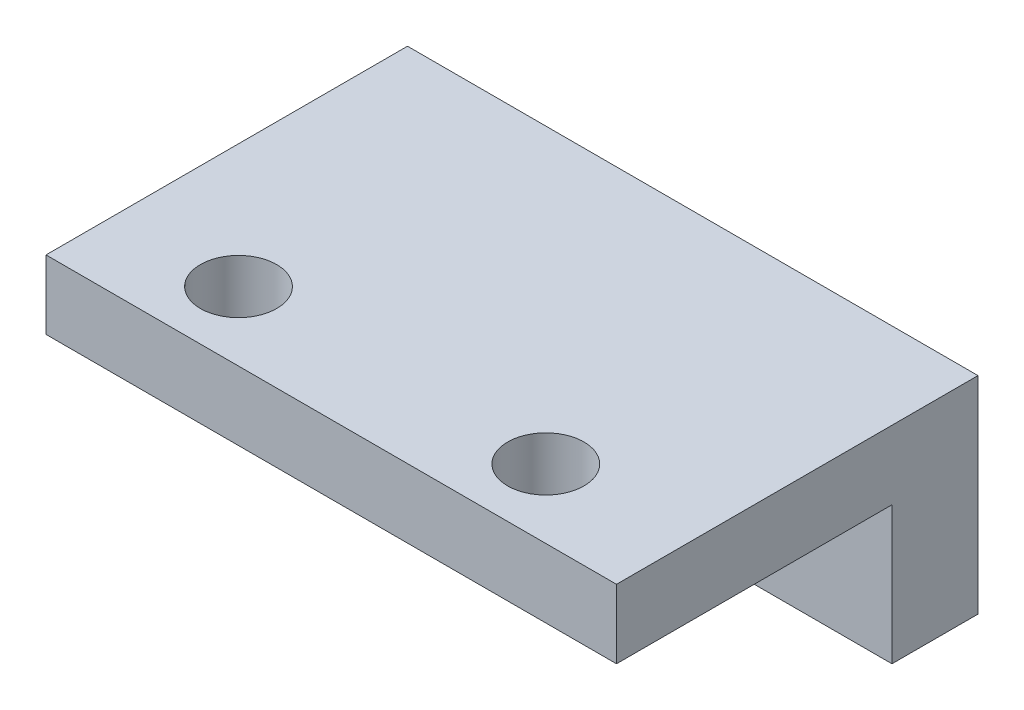
ISO-10303-21;
HEADER;
FILE_DESCRIPTION(('STEP AP214'),'2;1');
FILE_NAME('part.step','',(''),(''),'','','');
FILE_SCHEMA(('AUTOMOTIVE_DESIGN { 1 0 10303 214 1 1 1 1 }'));
ENDSEC;
DATA;
#1=APPLICATION_CONTEXT('core data for automotive mechanical design processes');
#2=APPLICATION_PROTOCOL_DEFINITION('international standard','automotive_design',2000,#1);
#3=PRODUCT_CONTEXT('',#1,'mechanical');
#4=PRODUCT('Part','Part','',(#3));
#5=PRODUCT_RELATED_PRODUCT_CATEGORY('part','',(#4));
#6=PRODUCT_DEFINITION_FORMATION('','',#4);
#7=PRODUCT_DEFINITION_CONTEXT('part definition',#1,'design');
#8=PRODUCT_DEFINITION('design','',#6,#7);
#9=PRODUCT_DEFINITION_SHAPE('','',#8);
#10=(LENGTH_UNIT() NAMED_UNIT(*) SI_UNIT(.MILLI.,.METRE.));
#11=(NAMED_UNIT(*) PLANE_ANGLE_UNIT() SI_UNIT($,.RADIAN.));
#12=(NAMED_UNIT(*) SI_UNIT($,.STERADIAN.) SOLID_ANGLE_UNIT());
#13=UNCERTAINTY_MEASURE_WITH_UNIT(LENGTH_MEASURE(1.E-05),#10,'distance_accuracy_value','');
#14=(GEOMETRIC_REPRESENTATION_CONTEXT(3) GLOBAL_UNCERTAINTY_ASSIGNED_CONTEXT((#13)) GLOBAL_UNIT_ASSIGNED_CONTEXT((#10,
#11,#12)) REPRESENTATION_CONTEXT('',''));
#15=CARTESIAN_POINT('',(0.,0.,0.));
#16=DIRECTION('',(0.,0.,1.));
#17=DIRECTION('',(1.,0.,0.));
#18=AXIS2_PLACEMENT_3D('',#15,#16,#17);
#19=CARTESIAN_POINT('',(0.,0.,20.));
#20=DIRECTION('',(0.,0.,-1.));
#21=DIRECTION('',(-1.,0.,0.));
#22=AXIS2_PLACEMENT_3D('',#19,#20,#21);
#23=PLANE('',#22);
#24=DIRECTION('',(0.,-1.,0.));
#25=VECTOR('',#24,1.);
#26=CARTESIAN_POINT('',(-47.7101744632059,-28.3065134969351,20.));
#27=LINE('',#26,#25);
#28=CARTESIAN_POINT('',(-47.7101744632059,-24.4965134969351,20.));
#29=VERTEX_POINT('',#28);
#30=CARTESIAN_POINT('',(-47.7101744632059,-28.3065134969351,20.));
#31=VERTEX_POINT('',#30);
#32=EDGE_CURVE('E90',#29,#31,#27,.T.);
#33=ORIENTED_EDGE('',*,*,#32,.T.);
#34=DIRECTION('',(-1.,0.,0.));
#35=VECTOR('',#34,1.);
#36=CARTESIAN_POINT('',(-47.7101744632059,-28.3065134969351,20.));
#37=LINE('',#36,#35);
#38=CARTESIAN_POINT('',(-16.1475056161858,-28.3065134969351,20.));
#39=VERTEX_POINT('',#38);
#40=EDGE_CURVE('E122',#39,#31,#37,.T.);
#41=ORIENTED_EDGE('',*,*,#40,.F.);
#42=DIRECTION('',(0.,1.,0.));
#43=VECTOR('',#42,1.);
#44=CARTESIAN_POINT('',(-16.1475056161858,-28.3065134969351,20.));
#45=LINE('',#44,#43);
#46=CARTESIAN_POINT('',(-16.1475056161858,-24.4965134969351,20.));
#47=VERTEX_POINT('',#46);
#48=EDGE_CURVE('E104',#39,#47,#45,.T.);
#49=ORIENTED_EDGE('',*,*,#48,.T.);
#50=DIRECTION('',(-1.,0.,0.));
#51=VECTOR('',#50,1.);
#52=CARTESIAN_POINT('',(-47.7101744632059,-24.4965134969351,20.));
#53=LINE('',#52,#51);
#54=EDGE_CURVE('E60',#47,#29,#53,.T.);
#55=ORIENTED_EDGE('',*,*,#54,.T.);
#56=EDGE_LOOP('',(#33,#41,#49,#55));
#57=FACE_BOUND('',#56,.T.);
#58=ADVANCED_FACE('F34',(#57),#23,.F.);
#59=CARTESIAN_POINT('',(0.,0.,0.));
#60=DIRECTION('',(0.,0.,-1.));
#61=DIRECTION('',(-1.,0.,0.));
#62=AXIS2_PLACEMENT_3D('',#59,#60,#61);
#63=PLANE('',#62);
#64=CARTESIAN_POINT('',(-40.8685682246879,-32.1165134969351,0.));
#65=DIRECTION('',(0.,0.,1.));
#66=DIRECTION('',(1.,0.,0.));
#67=AXIS2_PLACEMENT_3D('',#64,#65,#66);
#68=CIRCLE('',#67,2.);
#69=CARTESIAN_POINT('',(-38.8685682246879,-32.1165134969351,0.));
#70=VERTEX_POINT('',#69);
#71=EDGE_CURVE('E150',#70,#70,#68,.T.);
#72=ORIENTED_EDGE('',*,*,#71,.T.);
#73=EDGE_LOOP('',(#72));
#74=FACE_BOUND('',#73,.T.);
#75=DIRECTION('',(-1.,0.,0.));
#76=VECTOR('',#75,1.);
#77=CARTESIAN_POINT('',(-47.7101744632059,-24.4965134969351,0.));
#78=LINE('',#77,#76);
#79=CARTESIAN_POINT('',(-16.1475056161858,-24.4965134969351,0.));
#80=VERTEX_POINT('',#79);
#81=CARTESIAN_POINT('',(-47.7101744632059,-24.4965134969351,0.));
#82=VERTEX_POINT('',#81);
#83=EDGE_CURVE('E103',#80,#82,#78,.T.);
#84=ORIENTED_EDGE('',*,*,#83,.F.);
#85=DIRECTION('',(0.,1.,0.));
#86=VECTOR('',#85,1.);
#87=CARTESIAN_POINT('',(-16.1475056161858,-28.3065134969351,0.));
#88=LINE('',#87,#86);
#89=CARTESIAN_POINT('',(-16.1475056161858,-35.9265134969351,0.));
#90=VERTEX_POINT('',#89);
#91=EDGE_CURVE('E84',#90,#80,#88,.T.);
#92=ORIENTED_EDGE('',*,*,#91,.F.);
#93=DIRECTION('',(1.,0.,0.));
#94=VECTOR('',#93,1.);
#95=CARTESIAN_POINT('',(-16.1475056161858,-35.9265134969351,0.));
#96=LINE('',#95,#94);
#97=CARTESIAN_POINT('',(-47.7101744632059,-35.9265134969351,0.));
#98=VERTEX_POINT('',#97);
#99=EDGE_CURVE('E93',#98,#90,#96,.T.);
#100=ORIENTED_EDGE('',*,*,#99,.F.);
#101=DIRECTION('',(0.,-1.,0.));
#102=VECTOR('',#101,1.);
#103=CARTESIAN_POINT('',(-47.7101744632059,-28.3065134969351,0.));
#104=LINE('',#103,#102);
#105=EDGE_CURVE('E98',#82,#98,#104,.T.);
#106=ORIENTED_EDGE('',*,*,#105,.F.);
#107=EDGE_LOOP('',(#84,#92,#100,#106));
#108=FACE_BOUND('',#107,.T.);
#109=CARTESIAN_POINT('',(-23.8685682246964,-32.1165304531927,0.));
#110=DIRECTION('',(0.,0.,1.));
#111=DIRECTION('',(1.,0.,0.));
#112=AXIS2_PLACEMENT_3D('',#109,#110,#111);
#113=CIRCLE('',#112,2.00000000000001);
#114=CARTESIAN_POINT('',(-21.8685682246964,-32.1165304531927,0.));
#115=VERTEX_POINT('',#114);
#116=EDGE_CURVE('E147',#115,#115,#113,.T.);
#117=ORIENTED_EDGE('',*,*,#116,.T.);
#118=EDGE_LOOP('',(#117));
#119=FACE_BOUND('',#118,.T.);
#120=ADVANCED_FACE('F100',(#74,#108,#119),#63,.T.);
#121=CARTESIAN_POINT('',(-47.7101744632059,-24.4965134969351,20.));
#122=DIRECTION('',(0.,-1.,0.));
#123=DIRECTION('',(0.,0.,-1.));
#124=AXIS2_PLACEMENT_3D('',#121,#122,#123);
#125=PLANE('',#124);
#126=CARTESIAN_POINT('',(-23.8685682246964,-24.4965134969351,16.19));
#127=DIRECTION('',(0.,1.,0.));
#128=DIRECTION('',(0.,0.,1.));
#129=AXIS2_PLACEMENT_3D('',#126,#127,#128);
#130=CIRCLE('',#129,2.11);
#131=CARTESIAN_POINT('',(-23.8685682246964,-24.4965134969351,18.3));
#132=VERTEX_POINT('',#131);
#133=EDGE_CURVE('E118',#132,#132,#130,.T.);
#134=ORIENTED_EDGE('',*,*,#133,.F.);
#135=EDGE_LOOP('',(#134));
#136=FACE_BOUND('',#135,.T.);
#137=CARTESIAN_POINT('',(-40.8685682246879,-24.4965134969351,16.19));
#138=DIRECTION('',(0.,1.,0.));
#139=DIRECTION('',(0.,0.,1.));
#140=AXIS2_PLACEMENT_3D('',#137,#138,#139);
#141=CIRCLE('',#140,2.11);
#142=CARTESIAN_POINT('',(-40.8685682246879,-24.4965134969351,18.3));
#143=VERTEX_POINT('',#142);
#144=EDGE_CURVE('E124',#143,#143,#141,.T.);
#145=ORIENTED_EDGE('',*,*,#144,.F.);
#146=EDGE_LOOP('',(#145));
#147=FACE_BOUND('',#146,.T.);
#148=ORIENTED_EDGE('',*,*,#83,.T.);
#149=DIRECTION('',(0.,0.,-1.));
#150=VECTOR('',#149,1.);
#151=CARTESIAN_POINT('',(-47.7101744632059,-24.4965134969351,20.));
#152=LINE('',#151,#150);
#153=EDGE_CURVE('E43',#29,#82,#152,.T.);
#154=ORIENTED_EDGE('',*,*,#153,.F.);
#155=ORIENTED_EDGE('',*,*,#54,.F.);
#156=DIRECTION('',(0.,0.,-1.));
#157=VECTOR('',#156,1.);
#158=CARTESIAN_POINT('',(-16.1475056161858,-24.4965134969351,20.));
#159=LINE('',#158,#157);
#160=EDGE_CURVE('E11',#47,#80,#159,.T.);
#161=ORIENTED_EDGE('',*,*,#160,.T.);
#162=EDGE_LOOP('',(#148,#154,#155,#161));
#163=FACE_BOUND('',#162,.T.);
#164=ADVANCED_FACE('F36',(#136,#147,#163),#125,.F.);
#165=CARTESIAN_POINT('',(-47.7101744632059,-28.3065134969351,20.));
#166=DIRECTION('',(1.,0.,0.));
#167=DIRECTION('',(0.,1.,0.));
#168=AXIS2_PLACEMENT_3D('',#165,#166,#167);
#169=PLANE('',#168);
#170=DIRECTION('',(0.,-1.,0.));
#171=VECTOR('',#170,1.);
#172=CARTESIAN_POINT('',(-47.7101744632059,-35.9265134969351,4.76));
#173=LINE('',#172,#171);
#174=CARTESIAN_POINT('',(-47.7101744632059,-28.3065134969351,4.76));
#175=VERTEX_POINT('',#174);
#176=CARTESIAN_POINT('',(-47.7101744632059,-35.9265134969351,4.76));
#177=VERTEX_POINT('',#176);
#178=EDGE_CURVE('E131',#175,#177,#173,.T.);
#179=ORIENTED_EDGE('',*,*,#178,.F.);
#180=DIRECTION('',(0.,0.,1.));
#181=VECTOR('',#180,1.);
#182=CARTESIAN_POINT('',(-47.7101744632059,-28.3065134969351,4.76));
#183=LINE('',#182,#181);
#184=EDGE_CURVE('E115',#175,#31,#183,.T.);
#185=ORIENTED_EDGE('',*,*,#184,.T.);
#186=ORIENTED_EDGE('',*,*,#32,.F.);
#187=ORIENTED_EDGE('',*,*,#153,.T.);
#188=ORIENTED_EDGE('',*,*,#105,.T.);
#189=DIRECTION('',(0.,0.,-1.));
#190=VECTOR('',#189,1.);
#191=CARTESIAN_POINT('',(-47.7101744632059,-35.9265134969351,20.));
#192=LINE('',#191,#190);
#193=EDGE_CURVE('E89',#177,#98,#192,.T.);
#194=ORIENTED_EDGE('',*,*,#193,.F.);
#195=EDGE_LOOP('',(#179,#185,#186,#187,#188,#194));
#196=FACE_BOUND('',#195,.T.);
#197=ADVANCED_FACE('F157',(#196),#169,.F.);
#198=CARTESIAN_POINT('',(-16.1475056161858,-35.9265134969351,20.));
#199=DIRECTION('',(0.,1.,0.));
#200=DIRECTION('',(-1.,0.,0.));
#201=AXIS2_PLACEMENT_3D('',#198,#199,#200);
#202=PLANE('',#201);
#203=DIRECTION('',(0.,0.,-1.));
#204=VECTOR('',#203,1.);
#205=CARTESIAN_POINT('',(-16.1475056161858,-35.9265134969351,20.));
#206=LINE('',#205,#204);
#207=CARTESIAN_POINT('',(-16.1475056161858,-35.9265134969351,4.76));
#208=VERTEX_POINT('',#207);
#209=EDGE_CURVE('E78',#208,#90,#206,.T.);
#210=ORIENTED_EDGE('',*,*,#209,.F.);
#211=DIRECTION('',(1.,0.,0.));
#212=VECTOR('',#211,1.);
#213=CARTESIAN_POINT('',(-47.7101744632059,-35.9265134969351,4.76));
#214=LINE('',#213,#212);
#215=EDGE_CURVE('E51',#177,#208,#214,.T.);
#216=ORIENTED_EDGE('',*,*,#215,.F.);
#217=ORIENTED_EDGE('',*,*,#193,.T.);
#218=ORIENTED_EDGE('',*,*,#99,.T.);
#219=EDGE_LOOP('',(#210,#216,#217,#218));
#220=FACE_BOUND('',#219,.T.);
#221=ADVANCED_FACE('F94',(#220),#202,.F.);
#222=CARTESIAN_POINT('',(-16.1475056161858,-28.3065134969351,20.));
#223=DIRECTION('',(-1.,0.,0.));
#224=DIRECTION('',(0.,0.,1.));
#225=AXIS2_PLACEMENT_3D('',#222,#223,#224);
#226=PLANE('',#225);
#227=ORIENTED_EDGE('',*,*,#48,.F.);
#228=DIRECTION('',(0.,0.,1.));
#229=VECTOR('',#228,1.);
#230=CARTESIAN_POINT('',(-16.1475056161858,-28.3065134969351,4.76));
#231=LINE('',#230,#229);
#232=CARTESIAN_POINT('',(-16.1475056161858,-28.3065134969351,4.76));
#233=VERTEX_POINT('',#232);
#234=EDGE_CURVE('E138',#233,#39,#231,.T.);
#235=ORIENTED_EDGE('',*,*,#234,.F.);
#236=DIRECTION('',(0.,1.,0.));
#237=VECTOR('',#236,1.);
#238=CARTESIAN_POINT('',(-16.1475056161858,-35.9265134969351,4.76));
#239=LINE('',#238,#237);
#240=EDGE_CURVE('E87',#208,#233,#239,.T.);
#241=ORIENTED_EDGE('',*,*,#240,.F.);
#242=ORIENTED_EDGE('',*,*,#209,.T.);
#243=ORIENTED_EDGE('',*,*,#91,.T.);
#244=ORIENTED_EDGE('',*,*,#160,.F.);
#245=EDGE_LOOP('',(#227,#235,#241,#242,#243,#244));
#246=FACE_BOUND('',#245,.T.);
#247=ADVANCED_FACE('F81',(#246),#226,.F.);
#248=CARTESIAN_POINT('',(-40.8685682246879,-32.1165134969351,20.));
#249=DIRECTION('',(0.,0.,-1.));
#250=DIRECTION('',(-1.,0.,0.));
#251=AXIS2_PLACEMENT_3D('',#248,#249,#250);
#252=CYLINDRICAL_SURFACE('',#251,2.);
#253=CARTESIAN_POINT('',(-40.8685682246879,-32.1165134969351,4.76));
#254=DIRECTION('',(0.,0.,-1.));
#255=DIRECTION('',(-1.,0.,0.));
#256=AXIS2_PLACEMENT_3D('',#253,#254,#255);
#257=CIRCLE('',#256,2.);
#258=CARTESIAN_POINT('',(-42.8685682246879,-32.1165134969351,4.76));
#259=VERTEX_POINT('',#258);
#260=EDGE_CURVE('E114',#259,#259,#257,.T.);
#261=ORIENTED_EDGE('',*,*,#260,.F.);
#262=EDGE_LOOP('',(#261));
#263=FACE_BOUND('',#262,.T.);
#264=ORIENTED_EDGE('',*,*,#71,.F.);
#265=EDGE_LOOP('',(#264));
#266=FACE_BOUND('',#265,.T.);
#267=ADVANCED_FACE('F197',(#263,#266),#252,.F.);
#268=CARTESIAN_POINT('',(-23.8685682246964,-32.1165304531927,20.));
#269=DIRECTION('',(0.,0.,-1.));
#270=DIRECTION('',(-1.,0.,0.));
#271=AXIS2_PLACEMENT_3D('',#268,#269,#270);
#272=CYLINDRICAL_SURFACE('',#271,2.00000000000001);
#273=CARTESIAN_POINT('',(-23.8685682246964,-32.1165304531927,4.76));
#274=DIRECTION('',(0.,0.,-1.));
#275=DIRECTION('',(-1.,0.,0.));
#276=AXIS2_PLACEMENT_3D('',#273,#274,#275);
#277=CIRCLE('',#276,2.00000000000001);
#278=CARTESIAN_POINT('',(-25.8685682246964,-32.1165304531927,4.76));
#279=VERTEX_POINT('',#278);
#280=EDGE_CURVE('E112',#279,#279,#277,.T.);
#281=ORIENTED_EDGE('',*,*,#280,.F.);
#282=EDGE_LOOP('',(#281));
#283=FACE_BOUND('',#282,.T.);
#284=ORIENTED_EDGE('',*,*,#116,.F.);
#285=EDGE_LOOP('',(#284));
#286=FACE_BOUND('',#285,.T.);
#287=ADVANCED_FACE('F185',(#283,#286),#272,.F.);
#288=CARTESIAN_POINT('',(-47.7101744632059,-28.3065134969351,4.76));
#289=DIRECTION('',(0.,1.,0.));
#290=DIRECTION('',(0.,0.,1.));
#291=AXIS2_PLACEMENT_3D('',#288,#289,#290);
#292=PLANE('',#291);
#293=CARTESIAN_POINT('',(-23.8685682246964,-28.3065134969351,16.19));
#294=DIRECTION('',(0.,1.,0.));
#295=DIRECTION('',(0.,0.,1.));
#296=AXIS2_PLACEMENT_3D('',#293,#294,#295);
#297=CIRCLE('',#296,2.11);
#298=CARTESIAN_POINT('',(-23.8685682246964,-28.3065134969351,18.3));
#299=VERTEX_POINT('',#298);
#300=EDGE_CURVE('E38',#299,#299,#297,.T.);
#301=ORIENTED_EDGE('',*,*,#300,.T.);
#302=EDGE_LOOP('',(#301));
#303=FACE_BOUND('',#302,.T.);
#304=CARTESIAN_POINT('',(-40.8685682246879,-28.3065134969351,16.19));
#305=DIRECTION('',(0.,1.,0.));
#306=DIRECTION('',(0.,0.,1.));
#307=AXIS2_PLACEMENT_3D('',#304,#305,#306);
#308=CIRCLE('',#307,2.11);
#309=CARTESIAN_POINT('',(-40.8685682246879,-28.3065134969351,18.3));
#310=VERTEX_POINT('',#309);
#311=EDGE_CURVE('E116',#310,#310,#308,.T.);
#312=ORIENTED_EDGE('',*,*,#311,.T.);
#313=EDGE_LOOP('',(#312));
#314=FACE_BOUND('',#313,.T.);
#315=ORIENTED_EDGE('',*,*,#40,.T.);
#316=ORIENTED_EDGE('',*,*,#184,.F.);
#317=DIRECTION('',(-1.,0.,0.));
#318=VECTOR('',#317,1.);
#319=CARTESIAN_POINT('',(-47.7101744632059,-28.3065134969351,4.76));
#320=LINE('',#319,#318);
#321=EDGE_CURVE('E135',#233,#175,#320,.T.);
#322=ORIENTED_EDGE('',*,*,#321,.F.);
#323=ORIENTED_EDGE('',*,*,#234,.T.);
#324=EDGE_LOOP('',(#315,#316,#322,#323));
#325=FACE_BOUND('',#324,.T.);
#326=ADVANCED_FACE('F168',(#303,#314,#325),#292,.F.);
#327=CARTESIAN_POINT('',(0.,0.,4.76));
#328=DIRECTION('',(0.,0.,-1.));
#329=DIRECTION('',(-1.,0.,0.));
#330=AXIS2_PLACEMENT_3D('',#327,#328,#329);
#331=PLANE('',#330);
#332=ORIENTED_EDGE('',*,*,#260,.T.);
#333=EDGE_LOOP('',(#332));
#334=FACE_BOUND('',#333,.T.);
#335=ORIENTED_EDGE('',*,*,#280,.T.);
#336=EDGE_LOOP('',(#335));
#337=FACE_BOUND('',#336,.T.);
#338=ORIENTED_EDGE('',*,*,#178,.T.);
#339=ORIENTED_EDGE('',*,*,#215,.T.);
#340=ORIENTED_EDGE('',*,*,#240,.T.);
#341=ORIENTED_EDGE('',*,*,#321,.T.);
#342=EDGE_LOOP('',(#338,#339,#340,#341));
#343=FACE_BOUND('',#342,.T.);
#344=ADVANCED_FACE('F171',(#334,#337,#343),#331,.F.);
#345=CARTESIAN_POINT('',(-40.8685682246879,-34.9105134969351,16.19));
#346=DIRECTION('',(0.,1.,0.));
#347=DIRECTION('',(0.,0.,1.));
#348=AXIS2_PLACEMENT_3D('',#345,#346,#347);
#349=CYLINDRICAL_SURFACE('',#348,2.11);
#350=ORIENTED_EDGE('',*,*,#144,.T.);
#351=EDGE_LOOP('',(#350));
#352=FACE_BOUND('',#351,.T.);
#353=ORIENTED_EDGE('',*,*,#311,.F.);
#354=EDGE_LOOP('',(#353));
#355=FACE_BOUND('',#354,.T.);
#356=ADVANCED_FACE('F175',(#352,#355),#349,.F.);
#357=CARTESIAN_POINT('',(-23.8685682246964,-34.9105134969351,16.19));
#358=DIRECTION('',(0.,1.,0.));
#359=DIRECTION('',(0.,0.,1.));
#360=AXIS2_PLACEMENT_3D('',#357,#358,#359);
#361=CYLINDRICAL_SURFACE('',#360,2.11);
#362=ORIENTED_EDGE('',*,*,#133,.T.);
#363=EDGE_LOOP('',(#362));
#364=FACE_BOUND('',#363,.T.);
#365=ORIENTED_EDGE('',*,*,#300,.F.);
#366=EDGE_LOOP('',(#365));
#367=FACE_BOUND('',#366,.T.);
#368=ADVANCED_FACE('F182',(#364,#367),#361,.F.);
#369=CLOSED_SHELL('',(#58,#120,#164,#197,#221,#247,#267,#287,#326,#344,#356,#368));
#370=MANIFOLD_SOLID_BREP('B2',#369);
#371=ADVANCED_BREP_SHAPE_REPRESENTATION('',(#18,#370),#14);
#372=SHAPE_DEFINITION_REPRESENTATION(#9,#371);
ENDSEC;
END-ISO-10303-21;
